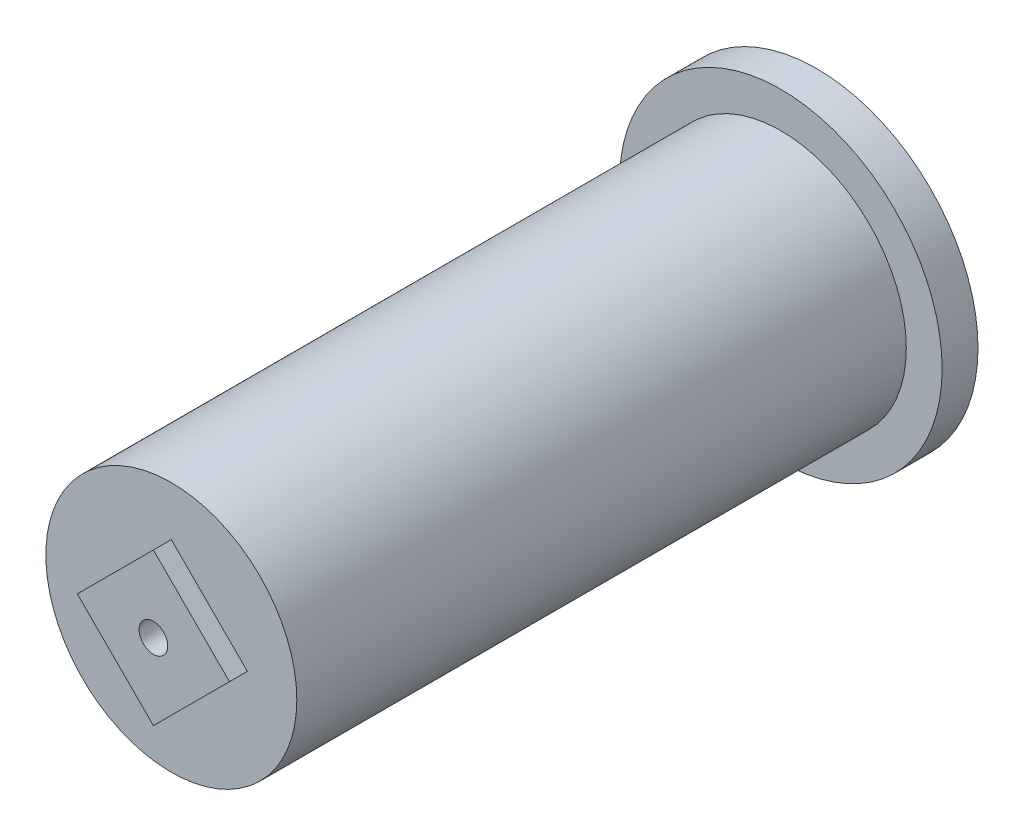
ISO-10303-21;
HEADER;
FILE_DESCRIPTION(('STEP AP214'),'2;1');
FILE_NAME('part.step','',(''),(''),'','','');
FILE_SCHEMA(('AUTOMOTIVE_DESIGN { 1 0 10303 214 1 1 1 1 }'));
ENDSEC;
DATA;
#1=APPLICATION_CONTEXT('core data for automotive mechanical design processes');
#2=APPLICATION_PROTOCOL_DEFINITION('international standard','automotive_design',2000,#1);
#3=PRODUCT_CONTEXT('',#1,'mechanical');
#4=PRODUCT('Part','Part','',(#3));
#5=PRODUCT_RELATED_PRODUCT_CATEGORY('part','',(#4));
#6=PRODUCT_DEFINITION_FORMATION('','',#4);
#7=PRODUCT_DEFINITION_CONTEXT('part definition',#1,'design');
#8=PRODUCT_DEFINITION('design','',#6,#7);
#9=PRODUCT_DEFINITION_SHAPE('','',#8);
#10=(LENGTH_UNIT() NAMED_UNIT(*) SI_UNIT(.MILLI.,.METRE.));
#11=(NAMED_UNIT(*) PLANE_ANGLE_UNIT() SI_UNIT($,.RADIAN.));
#12=(NAMED_UNIT(*) SI_UNIT($,.STERADIAN.) SOLID_ANGLE_UNIT());
#13=UNCERTAINTY_MEASURE_WITH_UNIT(LENGTH_MEASURE(1.E-05),#10,'distance_accuracy_value','');
#14=(GEOMETRIC_REPRESENTATION_CONTEXT(3) GLOBAL_UNCERTAINTY_ASSIGNED_CONTEXT((#13)) GLOBAL_UNIT_ASSIGNED_CONTEXT((#10,
#11,#12)) REPRESENTATION_CONTEXT('',''));
#15=CARTESIAN_POINT('',(0.,0.,0.));
#16=DIRECTION('',(0.,0.,1.));
#17=DIRECTION('',(1.,0.,0.));
#18=AXIS2_PLACEMENT_3D('',#15,#16,#17);
#19=CARTESIAN_POINT('',(0.,0.,5.));
#20=DIRECTION('',(0.,0.,-1.));
#21=DIRECTION('',(-1.,0.,0.));
#22=AXIS2_PLACEMENT_3D('',#19,#20,#21);
#23=CYLINDRICAL_SURFACE('',#22,22.5);
#24=CARTESIAN_POINT('',(0.,0.,5.));
#25=DIRECTION('',(0.,0.,1.));
#26=DIRECTION('',(1.,0.,0.));
#27=AXIS2_PLACEMENT_3D('',#24,#25,#26);
#28=CIRCLE('',#27,22.5);
#29=CARTESIAN_POINT('',(22.5,0.,5.));
#30=VERTEX_POINT('',#29);
#31=EDGE_CURVE('E41',#30,#30,#28,.T.);
#32=ORIENTED_EDGE('',*,*,#31,.F.);
#33=EDGE_LOOP('',(#32));
#34=FACE_BOUND('',#33,.T.);
#35=CARTESIAN_POINT('',(0.,0.,0.));
#36=DIRECTION('',(0.,0.,1.));
#37=DIRECTION('',(1.,0.,0.));
#38=AXIS2_PLACEMENT_3D('',#35,#36,#37);
#39=CIRCLE('',#38,22.5);
#40=CARTESIAN_POINT('',(22.5,0.,0.));
#41=VERTEX_POINT('',#40);
#42=EDGE_CURVE('E36',#41,#41,#39,.T.);
#43=ORIENTED_EDGE('',*,*,#42,.T.);
#44=EDGE_LOOP('',(#43));
#45=FACE_BOUND('',#44,.T.);
#46=ADVANCED_FACE('F33',(#34,#45),#23,.T.);
#47=CARTESIAN_POINT('',(0.,0.,5.));
#48=DIRECTION('',(0.,0.,1.));
#49=DIRECTION('',(1.,0.,0.));
#50=AXIS2_PLACEMENT_3D('',#47,#48,#49);
#51=PLANE('',#50);
#52=CARTESIAN_POINT('',(0.,0.,5.));
#53=DIRECTION('',(0.,0.,1.));
#54=DIRECTION('',(1.,0.,0.));
#55=AXIS2_PLACEMENT_3D('',#52,#53,#54);
#56=CIRCLE('',#55,17.5);
#57=CARTESIAN_POINT('',(17.5,0.,5.));
#58=VERTEX_POINT('',#57);
#59=EDGE_CURVE('E11',#58,#58,#56,.T.);
#60=ORIENTED_EDGE('',*,*,#59,.F.);
#61=EDGE_LOOP('',(#60));
#62=FACE_BOUND('',#61,.T.);
#63=ORIENTED_EDGE('',*,*,#31,.T.);
#64=EDGE_LOOP('',(#63));
#65=FACE_BOUND('',#64,.T.);
#66=ADVANCED_FACE('F112',(#62,#65),#51,.T.);
#67=CARTESIAN_POINT('',(0.,0.,0.));
#68=DIRECTION('',(0.,0.,1.));
#69=DIRECTION('',(1.,0.,0.));
#70=AXIS2_PLACEMENT_3D('',#67,#68,#69);
#71=PLANE('',#70);
#72=ORIENTED_EDGE('',*,*,#42,.F.);
#73=EDGE_LOOP('',(#72));
#74=FACE_BOUND('',#73,.T.);
#75=ADVANCED_FACE('F109',(#74),#71,.F.);
#76=CARTESIAN_POINT('',(0.,0.,90.));
#77=DIRECTION('',(0.,0.,-1.));
#78=DIRECTION('',(-1.,0.,0.));
#79=AXIS2_PLACEMENT_3D('',#76,#77,#78);
#80=CYLINDRICAL_SURFACE('',#79,17.5);
#81=CARTESIAN_POINT('',(0.,0.,90.));
#82=DIRECTION('',(0.,0.,1.));
#83=DIRECTION('',(1.,0.,0.));
#84=AXIS2_PLACEMENT_3D('',#81,#82,#83);
#85=CIRCLE('',#84,17.5);
#86=CARTESIAN_POINT('',(17.5,0.,90.));
#87=VERTEX_POINT('',#86);
#88=EDGE_CURVE('E95',#87,#87,#85,.T.);
#89=ORIENTED_EDGE('',*,*,#88,.F.);
#90=EDGE_LOOP('',(#89));
#91=FACE_BOUND('',#90,.T.);
#92=ORIENTED_EDGE('',*,*,#59,.T.);
#93=EDGE_LOOP('',(#92));
#94=FACE_BOUND('',#93,.T.);
#95=ADVANCED_FACE('F111',(#91,#94),#80,.T.);
#96=CARTESIAN_POINT('',(0.,0.,90.));
#97=DIRECTION('',(0.,0.,1.));
#98=DIRECTION('',(1.,0.,0.));
#99=AXIS2_PLACEMENT_3D('',#96,#97,#98);
#100=PLANE('',#99);
#101=DIRECTION('',(0.707106781186548,0.707106781186548,0.));
#102=VECTOR('',#101,1.);
#103=CARTESIAN_POINT('',(0.,-10.6066017177982,90.));
#104=LINE('',#103,#102);
#105=CARTESIAN_POINT('',(0.,-10.6066017177982,90.));
#106=VERTEX_POINT('',#105);
#107=CARTESIAN_POINT('',(10.6066017177982,0.,90.));
#108=VERTEX_POINT('',#107);
#109=EDGE_CURVE('E49',#106,#108,#104,.T.);
#110=ORIENTED_EDGE('',*,*,#109,.F.);
#111=DIRECTION('',(0.707106781186547,-0.707106781186547,0.));
#112=VECTOR('',#111,1.);
#113=CARTESIAN_POINT('',(-10.6066017177982,0.,90.));
#114=LINE('',#113,#112);
#115=CARTESIAN_POINT('',(-10.6066017177982,0.,90.));
#116=VERTEX_POINT('',#115);
#117=EDGE_CURVE('E53',#116,#106,#114,.T.);
#118=ORIENTED_EDGE('',*,*,#117,.F.);
#119=DIRECTION('',(-0.707106781186547,-0.707106781186548,0.));
#120=VECTOR('',#119,1.);
#121=CARTESIAN_POINT('',(0.,10.6066017177982,90.));
#122=LINE('',#121,#120);
#123=CARTESIAN_POINT('',(0.,10.6066017177982,90.));
#124=VERTEX_POINT('',#123);
#125=EDGE_CURVE('E229',#124,#116,#122,.T.);
#126=ORIENTED_EDGE('',*,*,#125,.F.);
#127=DIRECTION('',(-0.707106781186548,0.707106781186547,0.));
#128=VECTOR('',#127,1.);
#129=CARTESIAN_POINT('',(10.6066017177982,0.,90.));
#130=LINE('',#129,#128);
#131=EDGE_CURVE('E220',#108,#124,#130,.T.);
#132=ORIENTED_EDGE('',*,*,#131,.F.);
#133=EDGE_LOOP('',(#110,#118,#126,#132));
#134=FACE_BOUND('',#133,.T.);
#135=ORIENTED_EDGE('',*,*,#88,.T.);
#136=EDGE_LOOP('',(#135));
#137=FACE_BOUND('',#136,.T.);
#138=ADVANCED_FACE('F117',(#134,#137),#100,.T.);
#139=CARTESIAN_POINT('',(0.,-10.6066017177982,92.5));
#140=DIRECTION('',(-0.707106781186548,0.707106781186548,0.));
#141=DIRECTION('',(-0.707106781186548,-0.707106781186548,0.));
#142=AXIS2_PLACEMENT_3D('',#139,#140,#141);
#143=PLANE('',#142);
#144=ORIENTED_EDGE('',*,*,#109,.T.);
#145=DIRECTION('',(0.,0.,-1.));
#146=VECTOR('',#145,1.);
#147=CARTESIAN_POINT('',(10.6066017177982,0.,92.5));
#148=LINE('',#147,#146);
#149=CARTESIAN_POINT('',(10.6066017177982,0.,92.5));
#150=VERTEX_POINT('',#149);
#151=EDGE_CURVE('E78',#150,#108,#148,.T.);
#152=ORIENTED_EDGE('',*,*,#151,.F.);
#153=DIRECTION('',(0.707106781186548,0.707106781186548,0.));
#154=VECTOR('',#153,1.);
#155=CARTESIAN_POINT('',(0.,-10.6066017177982,92.5));
#156=LINE('',#155,#154);
#157=CARTESIAN_POINT('',(0.,-10.6066017177982,92.5));
#158=VERTEX_POINT('',#157);
#159=EDGE_CURVE('E84',#158,#150,#156,.T.);
#160=ORIENTED_EDGE('',*,*,#159,.F.);
#161=DIRECTION('',(0.,0.,-1.));
#162=VECTOR('',#161,1.);
#163=CARTESIAN_POINT('',(0.,-10.6066017177982,92.5));
#164=LINE('',#163,#162);
#165=EDGE_CURVE('E226',#158,#106,#164,.T.);
#166=ORIENTED_EDGE('',*,*,#165,.T.);
#167=EDGE_LOOP('',(#144,#152,#160,#166));
#168=FACE_BOUND('',#167,.T.);
#169=ADVANCED_FACE('F94',(#168),#143,.F.);
#170=CARTESIAN_POINT('',(10.6066017177982,0.,92.5));
#171=DIRECTION('',(-0.707106781186547,-0.707106781186548,0.));
#172=DIRECTION('',(0.707106781186548,-0.707106781186547,0.));
#173=AXIS2_PLACEMENT_3D('',#170,#171,#172);
#174=PLANE('',#173);
#175=ORIENTED_EDGE('',*,*,#131,.T.);
#176=DIRECTION('',(0.,0.,-1.));
#177=VECTOR('',#176,1.);
#178=CARTESIAN_POINT('',(0.,10.6066017177982,92.5));
#179=LINE('',#178,#177);
#180=CARTESIAN_POINT('',(0.,10.6066017177982,92.5));
#181=VERTEX_POINT('',#180);
#182=EDGE_CURVE('E80',#181,#124,#179,.T.);
#183=ORIENTED_EDGE('',*,*,#182,.F.);
#184=DIRECTION('',(-0.707106781186548,0.707106781186547,0.));
#185=VECTOR('',#184,1.);
#186=CARTESIAN_POINT('',(10.6066017177982,0.,92.5));
#187=LINE('',#186,#185);
#188=EDGE_CURVE('E73',#150,#181,#187,.T.);
#189=ORIENTED_EDGE('',*,*,#188,.F.);
#190=ORIENTED_EDGE('',*,*,#151,.T.);
#191=EDGE_LOOP('',(#175,#183,#189,#190));
#192=FACE_BOUND('',#191,.T.);
#193=ADVANCED_FACE('F76',(#192),#174,.F.);
#194=CARTESIAN_POINT('',(0.,10.6066017177982,92.5));
#195=DIRECTION('',(0.707106781186548,-0.707106781186547,0.));
#196=DIRECTION('',(0.707106781186547,0.707106781186548,0.));
#197=AXIS2_PLACEMENT_3D('',#194,#195,#196);
#198=PLANE('',#197);
#199=ORIENTED_EDGE('',*,*,#125,.T.);
#200=DIRECTION('',(0.,0.,-1.));
#201=VECTOR('',#200,1.);
#202=CARTESIAN_POINT('',(-10.6066017177982,0.,92.5));
#203=LINE('',#202,#201);
#204=CARTESIAN_POINT('',(-10.6066017177982,0.,92.5));
#205=VERTEX_POINT('',#204);
#206=EDGE_CURVE('E99',#205,#116,#203,.T.);
#207=ORIENTED_EDGE('',*,*,#206,.F.);
#208=DIRECTION('',(-0.707106781186547,-0.707106781186548,0.));
#209=VECTOR('',#208,1.);
#210=CARTESIAN_POINT('',(0.,10.6066017177982,92.5));
#211=LINE('',#210,#209);
#212=EDGE_CURVE('E83',#181,#205,#211,.T.);
#213=ORIENTED_EDGE('',*,*,#212,.F.);
#214=ORIENTED_EDGE('',*,*,#182,.T.);
#215=EDGE_LOOP('',(#199,#207,#213,#214));
#216=FACE_BOUND('',#215,.T.);
#217=ADVANCED_FACE('F163',(#216),#198,.F.);
#218=CARTESIAN_POINT('',(-10.6066017177982,0.,92.5));
#219=DIRECTION('',(0.707106781186547,0.707106781186548,0.));
#220=DIRECTION('',(-0.707106781186548,0.707106781186547,0.));
#221=AXIS2_PLACEMENT_3D('',#218,#219,#220);
#222=PLANE('',#221);
#223=ORIENTED_EDGE('',*,*,#117,.T.);
#224=ORIENTED_EDGE('',*,*,#165,.F.);
#225=DIRECTION('',(0.707106781186547,-0.707106781186547,0.));
#226=VECTOR('',#225,1.);
#227=CARTESIAN_POINT('',(-10.6066017177982,0.,92.5));
#228=LINE('',#227,#226);
#229=EDGE_CURVE('E89',#205,#158,#228,.T.);
#230=ORIENTED_EDGE('',*,*,#229,.F.);
#231=ORIENTED_EDGE('',*,*,#206,.T.);
#232=EDGE_LOOP('',(#223,#224,#230,#231));
#233=FACE_BOUND('',#232,.T.);
#234=ADVANCED_FACE('F172',(#233),#222,.F.);
#235=CARTESIAN_POINT('',(0.,0.,92.5));
#236=DIRECTION('',(0.,0.,1.));
#237=DIRECTION('',(1.,0.,0.));
#238=AXIS2_PLACEMENT_3D('',#235,#236,#237);
#239=PLANE('',#238);
#240=CARTESIAN_POINT('',(0.,0.,92.5));
#241=DIRECTION('',(0.,0.,1.));
#242=DIRECTION('',(1.,0.,0.));
#243=AXIS2_PLACEMENT_3D('',#240,#241,#242);
#244=CIRCLE('',#243,2.);
#245=CARTESIAN_POINT('',(2.,0.,92.5));
#246=VERTEX_POINT('',#245);
#247=EDGE_CURVE('E218',#246,#246,#244,.T.);
#248=ORIENTED_EDGE('',*,*,#247,.F.);
#249=EDGE_LOOP('',(#248));
#250=FACE_BOUND('',#249,.T.);
#251=ORIENTED_EDGE('',*,*,#159,.T.);
#252=ORIENTED_EDGE('',*,*,#188,.T.);
#253=ORIENTED_EDGE('',*,*,#212,.T.);
#254=ORIENTED_EDGE('',*,*,#229,.T.);
#255=EDGE_LOOP('',(#251,#252,#253,#254));
#256=FACE_BOUND('',#255,.T.);
#257=ADVANCED_FACE('F87',(#250,#256),#239,.T.);
#258=CARTESIAN_POINT('',(0.,0.,42.5));
#259=DIRECTION('',(0.,0.,1.));
#260=DIRECTION('',(1.,0.,0.));
#261=AXIS2_PLACEMENT_3D('',#258,#259,#260);
#262=CYLINDRICAL_SURFACE('',#261,2.);
#263=CARTESIAN_POINT('',(0.,0.,42.5));
#264=DIRECTION('',(0.,0.,1.));
#265=DIRECTION('',(1.,0.,0.));
#266=AXIS2_PLACEMENT_3D('',#263,#264,#265);
#267=CIRCLE('',#266,2.);
#268=CARTESIAN_POINT('',(2.,0.,42.5));
#269=VERTEX_POINT('',#268);
#270=EDGE_CURVE('E217',#269,#269,#267,.T.);
#271=ORIENTED_EDGE('',*,*,#270,.F.);
#272=EDGE_LOOP('',(#271));
#273=FACE_BOUND('',#272,.T.);
#274=ORIENTED_EDGE('',*,*,#247,.T.);
#275=EDGE_LOOP('',(#274));
#276=FACE_BOUND('',#275,.T.);
#277=ADVANCED_FACE('F191',(#273,#276),#262,.F.);
#278=CARTESIAN_POINT('',(0.,0.,42.5));
#279=DIRECTION('',(0.,0.,1.));
#280=DIRECTION('',(1.,0.,0.));
#281=AXIS2_PLACEMENT_3D('',#278,#279,#280);
#282=PLANE('',#281);
#283=ORIENTED_EDGE('',*,*,#270,.T.);
#284=EDGE_LOOP('',(#283));
#285=FACE_BOUND('',#284,.T.);
#286=ADVANCED_FACE('F201',(#285),#282,.T.);
#287=CLOSED_SHELL('',(#46,#66,#75,#95,#138,#169,#193,#217,#234,#257,#277,#286));
#288=MANIFOLD_SOLID_BREP('B2',#287);
#289=ADVANCED_BREP_SHAPE_REPRESENTATION('',(#18,#288),#14);
#290=SHAPE_DEFINITION_REPRESENTATION(#9,#289);
ENDSEC;
END-ISO-10303-21;
